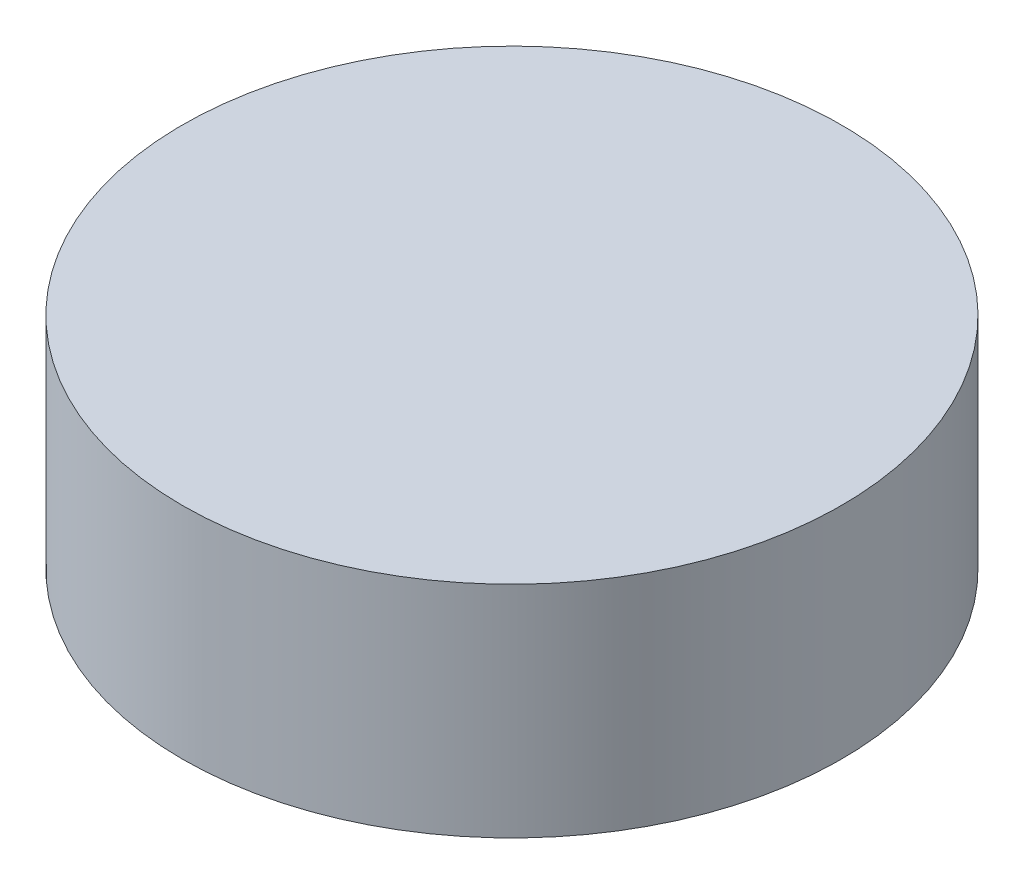
ISO-10303-21;
HEADER;
FILE_DESCRIPTION(('STEP AP214'),'2;1');
FILE_NAME('part.step','',(''),(''),'','','');
FILE_SCHEMA(('AUTOMOTIVE_DESIGN { 1 0 10303 214 1 1 1 1 }'));
ENDSEC;
DATA;
#1=APPLICATION_CONTEXT('core data for automotive mechanical design processes');
#2=APPLICATION_PROTOCOL_DEFINITION('international standard','automotive_design',2000,#1);
#3=PRODUCT_CONTEXT('',#1,'mechanical');
#4=PRODUCT('Part','Part','',(#3));
#5=PRODUCT_RELATED_PRODUCT_CATEGORY('part','',(#4));
#6=PRODUCT_DEFINITION_FORMATION('','',#4);
#7=PRODUCT_DEFINITION_CONTEXT('part definition',#1,'design');
#8=PRODUCT_DEFINITION('design','',#6,#7);
#9=PRODUCT_DEFINITION_SHAPE('','',#8);
#10=(LENGTH_UNIT() NAMED_UNIT(*) SI_UNIT(.MILLI.,.METRE.));
#11=(NAMED_UNIT(*) PLANE_ANGLE_UNIT() SI_UNIT($,.RADIAN.));
#12=(NAMED_UNIT(*) SI_UNIT($,.STERADIAN.) SOLID_ANGLE_UNIT());
#13=UNCERTAINTY_MEASURE_WITH_UNIT(LENGTH_MEASURE(1.E-05),#10,'distance_accuracy_value','');
#14=(GEOMETRIC_REPRESENTATION_CONTEXT(3) GLOBAL_UNCERTAINTY_ASSIGNED_CONTEXT((#13)) GLOBAL_UNIT_ASSIGNED_CONTEXT((#10,
#11,#12)) REPRESENTATION_CONTEXT('',''));
#15=CARTESIAN_POINT('',(0.,0.,0.));
#16=DIRECTION('',(0.,0.,1.));
#17=DIRECTION('',(1.,0.,0.));
#18=AXIS2_PLACEMENT_3D('',#15,#16,#17);
#19=CARTESIAN_POINT('',(0.,2.,0.));
#20=DIRECTION('',(0.,-1.,0.));
#21=DIRECTION('',(0.,0.,-1.));
#22=AXIS2_PLACEMENT_3D('',#19,#20,#21);
#23=CYLINDRICAL_SURFACE('',#22,3.);
#24=CARTESIAN_POINT('',(0.,2.,0.));
#25=DIRECTION('',(0.,1.,0.));
#26=DIRECTION('',(0.,0.,1.));
#27=AXIS2_PLACEMENT_3D('',#24,#25,#26);
#28=CIRCLE('',#27,3.);
#29=CARTESIAN_POINT('',(0.,2.,3.));
#30=VERTEX_POINT('',#29);
#31=EDGE_CURVE('E10',#30,#30,#28,.T.);
#32=ORIENTED_EDGE('',*,*,#31,.F.);
#33=EDGE_LOOP('',(#32));
#34=FACE_BOUND('',#33,.T.);
#35=CARTESIAN_POINT('',(0.,0.,0.));
#36=DIRECTION('',(0.,1.,0.));
#37=DIRECTION('',(0.,0.,1.));
#38=AXIS2_PLACEMENT_3D('',#35,#36,#37);
#39=CIRCLE('',#38,3.);
#40=CARTESIAN_POINT('',(0.,0.,3.));
#41=VERTEX_POINT('',#40);
#42=EDGE_CURVE('E38',#41,#41,#39,.T.);
#43=ORIENTED_EDGE('',*,*,#42,.T.);
#44=EDGE_LOOP('',(#43));
#45=FACE_BOUND('',#44,.T.);
#46=ADVANCED_FACE('F35',(#34,#45),#23,.T.);
#47=CARTESIAN_POINT('',(0.,2.,0.));
#48=DIRECTION('',(0.,1.,0.));
#49=DIRECTION('',(0.,0.,1.));
#50=AXIS2_PLACEMENT_3D('',#47,#48,#49);
#51=PLANE('',#50);
#52=ORIENTED_EDGE('',*,*,#31,.T.);
#53=EDGE_LOOP('',(#52));
#54=FACE_BOUND('',#53,.T.);
#55=ADVANCED_FACE('F50',(#54),#51,.T.);
#56=CARTESIAN_POINT('',(0.,0.,0.));
#57=DIRECTION('',(0.,1.,0.));
#58=DIRECTION('',(0.,0.,1.));
#59=AXIS2_PLACEMENT_3D('',#56,#57,#58);
#60=PLANE('',#59);
#61=ORIENTED_EDGE('',*,*,#42,.F.);
#62=EDGE_LOOP('',(#61));
#63=FACE_BOUND('',#62,.T.);
#64=ADVANCED_FACE('F48',(#63),#60,.F.);
#65=CLOSED_SHELL('',(#46,#55,#64));
#66=MANIFOLD_SOLID_BREP('B2',#65);
#67=ADVANCED_BREP_SHAPE_REPRESENTATION('',(#18,#66),#14);
#68=SHAPE_DEFINITION_REPRESENTATION(#9,#67);
ENDSEC;
END-ISO-10303-21;
